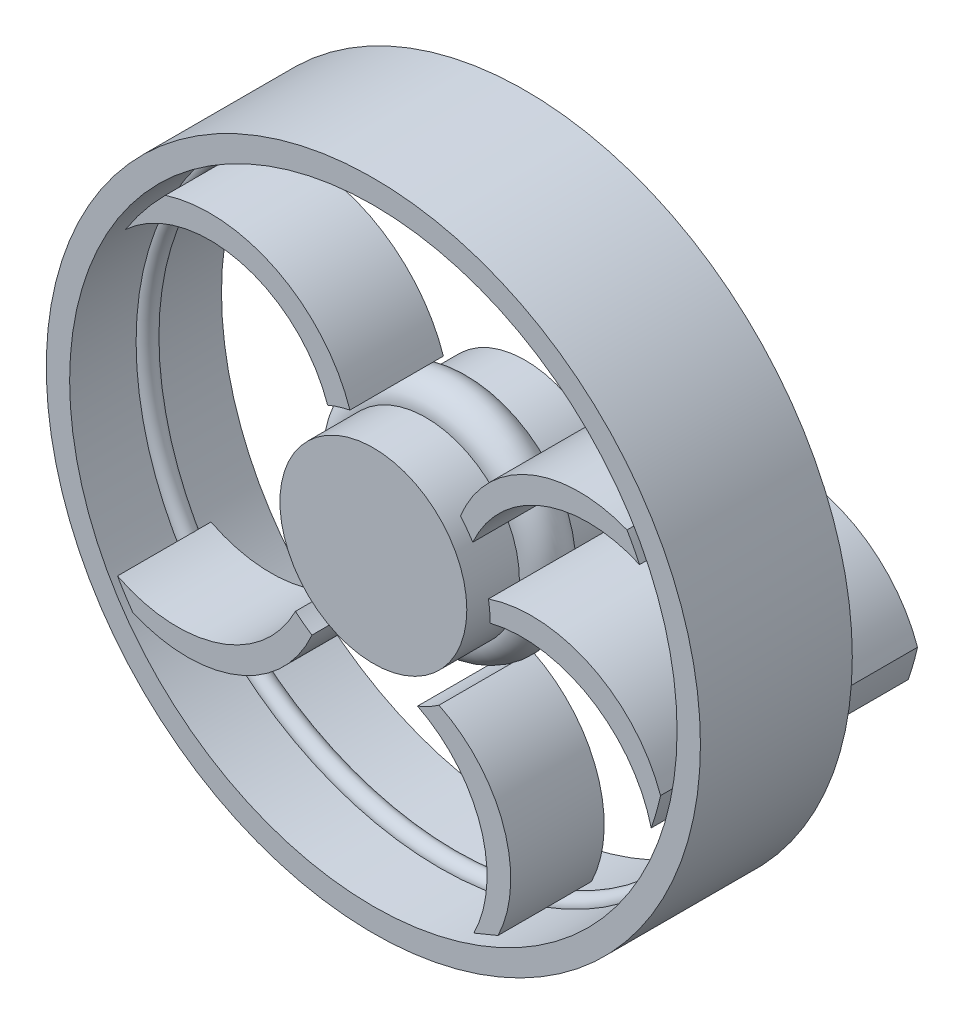
ISO-10303-21;
HEADER;
FILE_DESCRIPTION(('STEP AP214'),'2;1');
FILE_NAME('part.step','',(''),(''),'','','');
FILE_SCHEMA(('AUTOMOTIVE_DESIGN { 1 0 10303 214 1 1 1 1 }'));
ENDSEC;
DATA;
#1=APPLICATION_CONTEXT('core data for automotive mechanical design processes');
#2=APPLICATION_PROTOCOL_DEFINITION('international standard','automotive_design',2000,#1);
#3=PRODUCT_CONTEXT('',#1,'mechanical');
#4=PRODUCT('Part','Part','',(#3));
#5=PRODUCT_RELATED_PRODUCT_CATEGORY('part','',(#4));
#6=PRODUCT_DEFINITION_FORMATION('','',#4);
#7=PRODUCT_DEFINITION_CONTEXT('part definition',#1,'design');
#8=PRODUCT_DEFINITION('design','',#6,#7);
#9=PRODUCT_DEFINITION_SHAPE('','',#8);
#10=(LENGTH_UNIT() NAMED_UNIT(*) SI_UNIT(.MILLI.,.METRE.));
#11=(NAMED_UNIT(*) PLANE_ANGLE_UNIT() SI_UNIT($,.RADIAN.));
#12=(NAMED_UNIT(*) SI_UNIT($,.STERADIAN.) SOLID_ANGLE_UNIT());
#13=UNCERTAINTY_MEASURE_WITH_UNIT(LENGTH_MEASURE(1.E-05),#10,'distance_accuracy_value','');
#14=(GEOMETRIC_REPRESENTATION_CONTEXT(3) GLOBAL_UNCERTAINTY_ASSIGNED_CONTEXT((#13)) GLOBAL_UNIT_ASSIGNED_CONTEXT((#10,
#11,#12)) REPRESENTATION_CONTEXT('',''));
#15=CARTESIAN_POINT('',(0.,0.,0.));
#16=DIRECTION('',(0.,0.,1.));
#17=DIRECTION('',(1.,0.,0.));
#18=AXIS2_PLACEMENT_3D('',#15,#16,#17);
#19=CARTESIAN_POINT('',(0.,0.,-40.));
#20=DIRECTION('',(0.,0.,1.));
#21=DIRECTION('',(1.,0.,0.));
#22=AXIS2_PLACEMENT_3D('',#19,#20,#21);
#23=CYLINDRICAL_SURFACE('',#22,50.);
#24=CARTESIAN_POINT('',(0.,0.,0.));
#25=DIRECTION('',(0.,0.,1.));
#26=DIRECTION('',(1.,0.,0.));
#27=AXIS2_PLACEMENT_3D('',#24,#25,#26);
#28=CIRCLE('',#27,50.);
#29=CARTESIAN_POINT('',(18.9062541712212,-46.2877257295407,0.));
#30=VERTEX_POINT('',#29);
#31=CARTESIAN_POINT('',(28.0803125246057,-41.3702314293801,0.));
#32=VERTEX_POINT('',#31);
#33=EDGE_CURVE('E115',#30,#32,#28,.T.);
#34=ORIENTED_EDGE('',*,*,#33,.T.);
#35=DIRECTION('',(0.,0.,1.));
#36=VECTOR('',#35,1.);
#37=CARTESIAN_POINT('',(28.0803125246057,-41.3702314293801,-40.));
#38=LINE('',#37,#36);
#39=CARTESIAN_POINT('',(28.0803125246057,-41.3702314293801,-40.));
#40=VERTEX_POINT('',#39);
#41=EDGE_CURVE('E12',#40,#32,#38,.T.);
#42=ORIENTED_EDGE('',*,*,#41,.F.);
#43=CARTESIAN_POINT('',(0.,0.,-40.));
#44=DIRECTION('',(0.,0.,1.));
#45=DIRECTION('',(1.,0.,0.));
#46=AXIS2_PLACEMENT_3D('',#43,#44,#45);
#47=CIRCLE('',#46,50.);
#48=CARTESIAN_POINT('',(18.9062541712212,-46.2877257295407,-40.));
#49=VERTEX_POINT('',#48);
#50=EDGE_CURVE('E101',#49,#40,#47,.T.);
#51=ORIENTED_EDGE('',*,*,#50,.F.);
#52=DIRECTION('',(0.,0.,1.));
#53=VECTOR('',#52,1.);
#54=CARTESIAN_POINT('',(18.9062541712212,-46.2877257295407,-40.));
#55=LINE('',#54,#53);
#56=EDGE_CURVE('E68',#49,#30,#55,.T.);
#57=ORIENTED_EDGE('',*,*,#56,.T.);
#58=EDGE_LOOP('',(#34,#42,#51,#57));
#59=FACE_BOUND('',#58,.T.);
#60=ADVANCED_FACE('F52',(#59),#23,.F.);
#61=CARTESIAN_POINT('',(4.37211220984499,-90.369440988968,-40.));
#62=DIRECTION('',(0.,0.,1.));
#63=DIRECTION('',(1.,0.,0.));
#64=AXIS2_PLACEMENT_3D('',#61,#62,#63);
#65=CYLINDRICAL_SURFACE('',#64,54.4334575388081);
#66=CARTESIAN_POINT('',(4.37211220984499,-90.369440988968,0.));
#67=DIRECTION('',(0.,0.,-1.));
#68=DIRECTION('',(-1.,0.,0.));
#69=AXIS2_PLACEMENT_3D('',#66,#67,#68);
#70=CIRCLE('',#69,54.4334575388081);
#71=CARTESIAN_POINT('',(53.3713217694419,-114.07764130371,0.));
#72=VERTEX_POINT('',#71);
#73=EDGE_CURVE('E106',#32,#72,#70,.T.);
#74=ORIENTED_EDGE('',*,*,#73,.T.);
#75=DIRECTION('',(0.,0.,1.));
#76=VECTOR('',#75,1.);
#77=CARTESIAN_POINT('',(53.3713217694419,-114.07764130371,-40.));
#78=LINE('',#77,#76);
#79=CARTESIAN_POINT('',(53.3713217694419,-114.07764130371,-40.));
#80=VERTEX_POINT('',#79);
#81=EDGE_CURVE('E60',#80,#72,#78,.T.);
#82=ORIENTED_EDGE('',*,*,#81,.F.);
#83=CARTESIAN_POINT('',(4.37211220984499,-90.369440988968,-40.));
#84=DIRECTION('',(0.,0.,-1.));
#85=DIRECTION('',(-1.,0.,0.));
#86=AXIS2_PLACEMENT_3D('',#83,#84,#85);
#87=CIRCLE('',#86,54.4334575388081);
#88=EDGE_CURVE('E93',#40,#80,#87,.T.);
#89=ORIENTED_EDGE('',*,*,#88,.F.);
#90=ORIENTED_EDGE('',*,*,#41,.T.);
#91=EDGE_LOOP('',(#74,#82,#89,#90));
#92=FACE_BOUND('',#91,.T.);
#93=ADVANCED_FACE('F105',(#92),#65,.T.);
#94=CARTESIAN_POINT('',(43.0125590708784,-118.376021791655,-40.));
#95=DIRECTION('',(0.383264851547252,-0.923638486404969,0.));
#96=DIRECTION('',(0.923638486404969,0.383264851547252,0.));
#97=AXIS2_PLACEMENT_3D('',#94,#95,#96);
#98=PLANE('',#97);
#99=DIRECTION('',(0.923638486404969,0.383264851547252,0.));
#100=VECTOR('',#99,1.);
#101=CARTESIAN_POINT('',(43.0125590708784,-118.376021791655,0.));
#102=LINE('',#101,#100);
#103=CARTESIAN_POINT('',(43.0125590708784,-118.376021791655,0.));
#104=VERTEX_POINT('',#103);
#105=EDGE_CURVE('E118',#104,#72,#102,.T.);
#106=ORIENTED_EDGE('',*,*,#105,.F.);
#107=DIRECTION('',(0.,0.,1.));
#108=VECTOR('',#107,1.);
#109=CARTESIAN_POINT('',(43.0125590708784,-118.376021791655,-40.));
#110=LINE('',#109,#108);
#111=CARTESIAN_POINT('',(43.0125590708784,-118.376021791655,-40.));
#112=VERTEX_POINT('',#111);
#113=EDGE_CURVE('E82',#112,#104,#110,.T.);
#114=ORIENTED_EDGE('',*,*,#113,.F.);
#115=DIRECTION('',(0.923638486404969,0.383264851547252,0.));
#116=VECTOR('',#115,1.);
#117=CARTESIAN_POINT('',(43.0125590708784,-118.376021791655,-40.));
#118=LINE('',#117,#116);
#119=EDGE_CURVE('E100',#112,#80,#118,.T.);
#120=ORIENTED_EDGE('',*,*,#119,.T.);
#121=ORIENTED_EDGE('',*,*,#81,.T.);
#122=EDGE_LOOP('',(#106,#114,#120,#121));
#123=FACE_BOUND('',#122,.T.);
#124=ADVANCED_FACE('F109',(#123),#98,.T.);
#125=CARTESIAN_POINT('',(-5.11105888695548,-94.3938267669405,-40.));
#126=DIRECTION('',(0.,0.,1.));
#127=DIRECTION('',(1.,0.,0.));
#128=AXIS2_PLACEMENT_3D('',#125,#126,#127);
#129=CYLINDRICAL_SURFACE('',#128,53.7682832490957);
#130=CARTESIAN_POINT('',(-5.11105888695548,-94.3938267669405,0.));
#131=DIRECTION('',(0.,0.,-1.));
#132=DIRECTION('',(-1.,0.,0.));
#133=AXIS2_PLACEMENT_3D('',#130,#131,#132);
#134=CIRCLE('',#133,53.7682832490957);
#135=EDGE_CURVE('E120',#30,#104,#134,.T.);
#136=ORIENTED_EDGE('',*,*,#135,.F.);
#137=ORIENTED_EDGE('',*,*,#56,.F.);
#138=CARTESIAN_POINT('',(-5.11105888695548,-94.3938267669405,-40.));
#139=DIRECTION('',(0.,0.,-1.));
#140=DIRECTION('',(-1.,0.,0.));
#141=AXIS2_PLACEMENT_3D('',#138,#139,#140);
#142=CIRCLE('',#141,53.7682832490957);
#143=EDGE_CURVE('E110',#49,#112,#142,.T.);
#144=ORIENTED_EDGE('',*,*,#143,.T.);
#145=ORIENTED_EDGE('',*,*,#113,.T.);
#146=EDGE_LOOP('',(#136,#137,#144,#145));
#147=FACE_BOUND('',#146,.T.);
#148=ADVANCED_FACE('F126',(#147),#129,.F.);
#149=CARTESIAN_POINT('',(0.,0.,-40.));
#150=DIRECTION('',(0.,0.,1.));
#151=DIRECTION('',(1.,0.,0.));
#152=AXIS2_PLACEMENT_3D('',#149,#150,#151);
#153=PLANE('',#152);
#154=ORIENTED_EDGE('',*,*,#50,.T.);
#155=ORIENTED_EDGE('',*,*,#88,.T.);
#156=ORIENTED_EDGE('',*,*,#119,.F.);
#157=ORIENTED_EDGE('',*,*,#143,.F.);
#158=EDGE_LOOP('',(#154,#155,#156,#157));
#159=FACE_BOUND('',#158,.T.);
#160=ADVANCED_FACE('F97',(#159),#153,.F.);
#161=CARTESIAN_POINT('',(0.,0.,0.));
#162=DIRECTION('',(0.,0.,1.));
#163=DIRECTION('',(1.,0.,0.));
#164=AXIS2_PLACEMENT_3D('',#161,#162,#163);
#165=PLANE('',#164);
#166=ORIENTED_EDGE('',*,*,#33,.F.);
#167=ORIENTED_EDGE('',*,*,#135,.T.);
#168=ORIENTED_EDGE('',*,*,#105,.T.);
#169=ORIENTED_EDGE('',*,*,#73,.F.);
#170=EDGE_LOOP('',(#166,#167,#168,#169));
#171=FACE_BOUND('',#170,.T.);
#172=ADVANCED_FACE('F125',(#171),#165,.T.);
#173=CLOSED_SHELL('',(#60,#93,#124,#148,#160,#172));
#174=MANIFOLD_SOLID_BREP('B2',#173);
#175=CARTESIAN_POINT('',(0.,0.,-40.));
#176=DIRECTION('',(0.,0.,1.));
#177=DIRECTION('',(1.,0.,0.));
#178=AXIS2_PLACEMENT_3D('',#175,#176,#177);
#179=CYLINDRICAL_SURFACE('',#178,50.);
#180=CARTESIAN_POINT('',(0.,0.,0.));
#181=DIRECTION('',(0.,0.,1.));
#182=DIRECTION('',(1.,0.,0.));
#183=AXIS2_PLACEMENT_3D('',#180,#181,#182);
#184=CIRCLE('',#183,50.);
#185=CARTESIAN_POINT('',(42.5423741580309,26.2706376206993,0.));
#186=VERTEX_POINT('',#185);
#187=CARTESIAN_POINT('',(37.2664270143776,33.3348678950745,0.));
#188=VERTEX_POINT('',#187);
#189=EDGE_CURVE('E249',#186,#188,#184,.T.);
#190=ORIENTED_EDGE('',*,*,#189,.T.);
#191=DIRECTION('',(0.,0.,1.));
#192=VECTOR('',#191,1.);
#193=CARTESIAN_POINT('',(37.2664270143776,33.3348678950745,-40.));
#194=LINE('',#193,#192);
#195=CARTESIAN_POINT('',(37.2664270143776,33.3348678950745,-40.));
#196=VERTEX_POINT('',#195);
#197=EDGE_CURVE('E50',#196,#188,#194,.T.);
#198=ORIENTED_EDGE('',*,*,#197,.F.);
#199=CARTESIAN_POINT('',(0.,0.,-40.));
#200=DIRECTION('',(0.,0.,1.));
#201=DIRECTION('',(1.,0.,0.));
#202=AXIS2_PLACEMENT_3D('',#199,#200,#201);
#203=CIRCLE('',#202,50.);
#204=CARTESIAN_POINT('',(42.5423741580309,26.2706376206993,-40.));
#205=VERTEX_POINT('',#204);
#206=EDGE_CURVE('E235',#205,#196,#203,.T.);
#207=ORIENTED_EDGE('',*,*,#206,.F.);
#208=DIRECTION('',(0.,0.,1.));
#209=VECTOR('',#208,1.);
#210=CARTESIAN_POINT('',(42.5423741580309,26.2706376206993,-40.));
#211=LINE('',#210,#209);
#212=EDGE_CURVE('E202',#205,#186,#211,.T.);
#213=ORIENTED_EDGE('',*,*,#212,.T.);
#214=EDGE_LOOP('',(#190,#198,#207,#213));
#215=FACE_BOUND('',#214,.T.);
#216=ADVANCED_FACE('F186',(#215),#179,.F.);
#217=CARTESIAN_POINT('',(88.1709478208434,12.9366059497339,-40.));
#218=DIRECTION('',(0.,0.,1.));
#219=DIRECTION('',(1.,0.,0.));
#220=AXIS2_PLACEMENT_3D('',#217,#218,#219);
#221=CYLINDRICAL_SURFACE('',#220,54.8393957746312);
#222=CARTESIAN_POINT('',(88.1709478208434,12.9366059497339,0.));
#223=DIRECTION('',(0.,0.,-1.));
#224=DIRECTION('',(-1.,0.,0.));
#225=AXIS2_PLACEMENT_3D('',#222,#223,#224);
#226=CIRCLE('',#225,54.8393957746312);
#227=CARTESIAN_POINT('',(108.569209755877,63.8411267603298,0.));
#228=VERTEX_POINT('',#227);
#229=EDGE_CURVE('E240',#188,#228,#226,.T.);
#230=ORIENTED_EDGE('',*,*,#229,.T.);
#231=DIRECTION('',(0.,0.,1.));
#232=VECTOR('',#231,1.);
#233=CARTESIAN_POINT('',(108.569209755877,63.8411267603298,-40.));
#234=LINE('',#233,#232);
#235=CARTESIAN_POINT('',(108.569209755877,63.8411267603298,-40.));
#236=VERTEX_POINT('',#235);
#237=EDGE_CURVE('E194',#236,#228,#234,.T.);
#238=ORIENTED_EDGE('',*,*,#237,.F.);
#239=CARTESIAN_POINT('',(88.1709478208434,12.9366059497339,-40.));
#240=DIRECTION('',(0.,0.,-1.));
#241=DIRECTION('',(-1.,0.,0.));
#242=AXIS2_PLACEMENT_3D('',#239,#240,#241);
#243=CIRCLE('',#242,54.8393957746312);
#244=EDGE_CURVE('E227',#196,#236,#243,.T.);
#245=ORIENTED_EDGE('',*,*,#244,.F.);
#246=ORIENTED_EDGE('',*,*,#197,.T.);
#247=EDGE_LOOP('',(#230,#238,#245,#246));
#248=FACE_BOUND('',#247,.T.);
#249=ADVANCED_FACE('F239',(#248),#221,.T.);
#250=CARTESIAN_POINT('',(0.,0.,-40.));
#251=DIRECTION('',(0.,0.,1.));
#252=DIRECTION('',(1.,0.,0.));
#253=AXIS2_PLACEMENT_3D('',#250,#251,#252);
#254=CYLINDRICAL_SURFACE('',#253,125.948254346951);
#255=CARTESIAN_POINT('',(0.,0.,0.));
#256=DIRECTION('',(0.,0.,1.));
#257=DIRECTION('',(1.,0.,0.));
#258=AXIS2_PLACEMENT_3D('',#255,#256,#257);
#259=CIRCLE('',#258,125.948254346951);
#260=CARTESIAN_POINT('',(113.940281581626,53.6709884960567,0.));
#261=VERTEX_POINT('',#260);
#262=EDGE_CURVE('E252',#261,#228,#259,.T.);
#263=ORIENTED_EDGE('',*,*,#262,.F.);
#264=DIRECTION('',(0.,0.,1.));
#265=VECTOR('',#264,1.);
#266=CARTESIAN_POINT('',(113.940281581626,53.6709884960567,-40.));
#267=LINE('',#266,#265);
#268=CARTESIAN_POINT('',(113.940281581626,53.6709884960567,-40.));
#269=VERTEX_POINT('',#268);
#270=EDGE_CURVE('E216',#269,#261,#267,.T.);
#271=ORIENTED_EDGE('',*,*,#270,.F.);
#272=CARTESIAN_POINT('',(0.,0.,-40.));
#273=DIRECTION('',(0.,0.,1.));
#274=DIRECTION('',(1.,0.,0.));
#275=AXIS2_PLACEMENT_3D('',#272,#273,#274);
#276=CIRCLE('',#275,125.948254346951);
#277=EDGE_CURVE('E234',#269,#236,#276,.T.);
#278=ORIENTED_EDGE('',*,*,#277,.T.);
#279=ORIENTED_EDGE('',*,*,#237,.T.);
#280=EDGE_LOOP('',(#263,#271,#278,#279));
#281=FACE_BOUND('',#280,.T.);
#282=ADVANCED_FACE('F243',(#281),#254,.T.);
#283=CARTESIAN_POINT('',(91.9415033078629,4.27185934565388,-40.));
#284=DIRECTION('',(0.,0.,1.));
#285=DIRECTION('',(1.,0.,0.));
#286=AXIS2_PLACEMENT_3D('',#283,#284,#285);
#287=CYLINDRICAL_SURFACE('',#286,54.0760594566245);
#288=CARTESIAN_POINT('',(91.9415033078629,4.27185934565388,0.));
#289=DIRECTION('',(0.,0.,-1.));
#290=DIRECTION('',(-1.,0.,0.));
#291=AXIS2_PLACEMENT_3D('',#288,#289,#290);
#292=CIRCLE('',#291,54.0760594566245);
#293=EDGE_CURVE('E254',#186,#261,#292,.T.);
#294=ORIENTED_EDGE('',*,*,#293,.F.);
#295=ORIENTED_EDGE('',*,*,#212,.F.);
#296=CARTESIAN_POINT('',(91.9415033078629,4.27185934565388,-40.));
#297=DIRECTION('',(0.,0.,-1.));
#298=DIRECTION('',(-1.,0.,0.));
#299=AXIS2_PLACEMENT_3D('',#296,#297,#298);
#300=CIRCLE('',#299,54.0760594566245);
#301=EDGE_CURVE('E244',#205,#269,#300,.T.);
#302=ORIENTED_EDGE('',*,*,#301,.T.);
#303=ORIENTED_EDGE('',*,*,#270,.T.);
#304=EDGE_LOOP('',(#294,#295,#302,#303));
#305=FACE_BOUND('',#304,.T.);
#306=ADVANCED_FACE('F260',(#305),#287,.F.);
#307=CARTESIAN_POINT('',(44.0854739104217,6.46830297486697,-40.));
#308=DIRECTION('',(0.,0.,1.));
#309=DIRECTION('',(1.,0.,0.));
#310=AXIS2_PLACEMENT_3D('',#307,#308,#309);
#311=PLANE('',#310);
#312=ORIENTED_EDGE('',*,*,#206,.T.);
#313=ORIENTED_EDGE('',*,*,#244,.T.);
#314=ORIENTED_EDGE('',*,*,#277,.F.);
#315=ORIENTED_EDGE('',*,*,#301,.F.);
#316=EDGE_LOOP('',(#312,#313,#314,#315));
#317=FACE_BOUND('',#316,.T.);
#318=ADVANCED_FACE('F231',(#317),#311,.F.);
#319=CARTESIAN_POINT('',(44.0854739104217,6.46830297486697,0.));
#320=DIRECTION('',(0.,0.,1.));
#321=DIRECTION('',(1.,0.,0.));
#322=AXIS2_PLACEMENT_3D('',#319,#320,#321);
#323=PLANE('',#322);
#324=ORIENTED_EDGE('',*,*,#189,.F.);
#325=ORIENTED_EDGE('',*,*,#293,.T.);
#326=ORIENTED_EDGE('',*,*,#262,.T.);
#327=ORIENTED_EDGE('',*,*,#229,.F.);
#328=EDGE_LOOP('',(#324,#325,#326,#327));
#329=FACE_BOUND('',#328,.T.);
#330=ADVANCED_FACE('F259',(#329),#323,.T.);
#331=CLOSED_SHELL('',(#216,#249,#282,#306,#318,#330));
#332=MANIFOLD_SOLID_BREP('B6',#331);
#333=CARTESIAN_POINT('',(0.,0.,-40.));
#334=DIRECTION('',(0.,0.,1.));
#335=DIRECTION('',(1.,0.,0.));
#336=AXIS2_PLACEMENT_3D('',#333,#334,#335);
#337=CYLINDRICAL_SURFACE('',#336,50.);
#338=CARTESIAN_POINT('',(0.,0.,0.));
#339=DIRECTION('',(0.,0.,1.));
#340=DIRECTION('',(1.,0.,0.));
#341=AXIS2_PLACEMENT_3D('',#338,#339,#340);
#342=CIRCLE('',#341,50.);
#343=CARTESIAN_POINT('',(-33.3348678950743,-37.2664270143777,0.));
#344=VERTEX_POINT('',#343);
#345=CARTESIAN_POINT('',(-26.2706376206991,-42.542374158031,0.));
#346=VERTEX_POINT('',#345);
#347=EDGE_CURVE('E383',#344,#346,#342,.T.);
#348=ORIENTED_EDGE('',*,*,#347,.T.);
#349=DIRECTION('',(0.,0.,1.));
#350=VECTOR('',#349,1.);
#351=CARTESIAN_POINT('',(-26.2706376206991,-42.542374158031,-40.));
#352=LINE('',#351,#350);
#353=CARTESIAN_POINT('',(-26.2706376206991,-42.542374158031,-40.));
#354=VERTEX_POINT('',#353);
#355=EDGE_CURVE('E184',#354,#346,#352,.T.);
#356=ORIENTED_EDGE('',*,*,#355,.F.);
#357=CARTESIAN_POINT('',(0.,0.,-40.));
#358=DIRECTION('',(0.,0.,1.));
#359=DIRECTION('',(1.,0.,0.));
#360=AXIS2_PLACEMENT_3D('',#357,#358,#359);
#361=CIRCLE('',#360,50.);
#362=CARTESIAN_POINT('',(-33.3348678950743,-37.2664270143777,-40.));
#363=VERTEX_POINT('',#362);
#364=EDGE_CURVE('E369',#363,#354,#361,.T.);
#365=ORIENTED_EDGE('',*,*,#364,.F.);
#366=DIRECTION('',(0.,0.,1.));
#367=VECTOR('',#366,1.);
#368=CARTESIAN_POINT('',(-33.3348678950743,-37.2664270143777,-40.));
#369=LINE('',#368,#367);
#370=EDGE_CURVE('E336',#363,#344,#369,.T.);
#371=ORIENTED_EDGE('',*,*,#370,.T.);
#372=EDGE_LOOP('',(#348,#356,#365,#371));
#373=FACE_BOUND('',#372,.T.);
#374=ADVANCED_FACE('F320',(#373),#337,.F.);
#375=CARTESIAN_POINT('',(-79.6015695015972,-19.1217618605313,-40.));
#376=DIRECTION('',(0.,0.,1.));
#377=DIRECTION('',(1.,0.,0.));
#378=AXIS2_PLACEMENT_3D('',#375,#376,#377);
#379=CYLINDRICAL_SURFACE('',#378,58.247003147585);
#380=CARTESIAN_POINT('',(-79.6015695015972,-19.1217618605313,0.));
#381=DIRECTION('',(0.,0.,-1.));
#382=DIRECTION('',(-1.,0.,0.));
#383=AXIS2_PLACEMENT_3D('',#380,#381,#382);
#384=CIRCLE('',#383,58.247003147585);
#385=CARTESIAN_POINT('',(-103.022181799158,-72.4526937414027,0.));
#386=VERTEX_POINT('',#385);
#387=EDGE_CURVE('E374',#346,#386,#384,.T.);
#388=ORIENTED_EDGE('',*,*,#387,.T.);
#389=DIRECTION('',(0.,0.,1.));
#390=VECTOR('',#389,1.);
#391=CARTESIAN_POINT('',(-103.022181799158,-72.4526937414027,-40.));
#392=LINE('',#391,#390);
#393=CARTESIAN_POINT('',(-103.022181799158,-72.4526937414027,-40.));
#394=VERTEX_POINT('',#393);
#395=EDGE_CURVE('E328',#394,#386,#392,.T.);
#396=ORIENTED_EDGE('',*,*,#395,.F.);
#397=CARTESIAN_POINT('',(-79.6015695015972,-19.1217618605313,-40.));
#398=DIRECTION('',(0.,0.,-1.));
#399=DIRECTION('',(-1.,0.,0.));
#400=AXIS2_PLACEMENT_3D('',#397,#398,#399);
#401=CIRCLE('',#400,58.247003147585);
#402=EDGE_CURVE('E361',#354,#394,#401,.T.);
#403=ORIENTED_EDGE('',*,*,#402,.F.);
#404=ORIENTED_EDGE('',*,*,#355,.T.);
#405=EDGE_LOOP('',(#388,#396,#403,#404));
#406=FACE_BOUND('',#405,.T.);
#407=ADVANCED_FACE('F373',(#406),#379,.T.);
#408=CARTESIAN_POINT('',(0.,0.,-40.));
#409=DIRECTION('',(0.,0.,1.));
#410=DIRECTION('',(1.,0.,0.));
#411=AXIS2_PLACEMENT_3D('',#408,#409,#410);
#412=CYLINDRICAL_SURFACE('',#411,125.948254346951);
#413=CARTESIAN_POINT('',(0.,0.,0.));
#414=DIRECTION('',(0.,0.,1.));
#415=DIRECTION('',(1.,0.,0.));
#416=AXIS2_PLACEMENT_3D('',#413,#414,#415);
#417=CIRCLE('',#416,125.948254346951);
#418=CARTESIAN_POINT('',(-109.497512233642,-62.2355010238338,0.));
#419=VERTEX_POINT('',#418);
#420=EDGE_CURVE('E386',#419,#386,#417,.T.);
#421=ORIENTED_EDGE('',*,*,#420,.F.);
#422=DIRECTION('',(0.,0.,1.));
#423=VECTOR('',#422,1.);
#424=CARTESIAN_POINT('',(-109.497512233642,-62.2355010238338,-40.));
#425=LINE('',#424,#423);
#426=CARTESIAN_POINT('',(-109.497512233642,-62.2355010238338,-40.));
#427=VERTEX_POINT('',#426);
#428=EDGE_CURVE('E350',#427,#419,#425,.T.);
#429=ORIENTED_EDGE('',*,*,#428,.F.);
#430=CARTESIAN_POINT('',(0.,0.,-40.));
#431=DIRECTION('',(0.,0.,1.));
#432=DIRECTION('',(1.,0.,0.));
#433=AXIS2_PLACEMENT_3D('',#430,#431,#432);
#434=CIRCLE('',#433,125.948254346951);
#435=EDGE_CURVE('E368',#427,#394,#434,.T.);
#436=ORIENTED_EDGE('',*,*,#435,.T.);
#437=ORIENTED_EDGE('',*,*,#395,.T.);
#438=EDGE_LOOP('',(#421,#429,#436,#437));
#439=FACE_BOUND('',#438,.T.);
#440=ADVANCED_FACE('F377',(#439),#412,.T.);
#441=CARTESIAN_POINT('',(-83.900727091019,-11.6696417829208,-40.));
#442=DIRECTION('',(0.,0.,1.));
#443=DIRECTION('',(1.,0.,0.));
#444=AXIS2_PLACEMENT_3D('',#441,#442,#443);
#445=CYLINDRICAL_SURFACE('',#444,56.6754049867262);
#446=CARTESIAN_POINT('',(-83.900727091019,-11.6696417829208,0.));
#447=DIRECTION('',(0.,0.,-1.));
#448=DIRECTION('',(-1.,0.,0.));
#449=AXIS2_PLACEMENT_3D('',#446,#447,#448);
#450=CIRCLE('',#449,56.6754049867262);
#451=EDGE_CURVE('E388',#344,#419,#450,.T.);
#452=ORIENTED_EDGE('',*,*,#451,.F.);
#453=ORIENTED_EDGE('',*,*,#370,.F.);
#454=CARTESIAN_POINT('',(-83.900727091019,-11.6696417829208,-40.));
#455=DIRECTION('',(0.,0.,-1.));
#456=DIRECTION('',(-1.,0.,0.));
#457=AXIS2_PLACEMENT_3D('',#454,#455,#456);
#458=CIRCLE('',#457,56.6754049867262);
#459=EDGE_CURVE('E378',#363,#427,#458,.T.);
#460=ORIENTED_EDGE('',*,*,#459,.T.);
#461=ORIENTED_EDGE('',*,*,#428,.T.);
#462=EDGE_LOOP('',(#452,#453,#460,#461));
#463=FACE_BOUND('',#462,.T.);
#464=ADVANCED_FACE('F394',(#463),#445,.F.);
#465=CARTESIAN_POINT('',(-39.8007847507986,-9.56088093026566,-40.));
#466=DIRECTION('',(0.,0.,1.));
#467=DIRECTION('',(1.,0.,0.));
#468=AXIS2_PLACEMENT_3D('',#465,#466,#467);
#469=PLANE('',#468);
#470=ORIENTED_EDGE('',*,*,#364,.T.);
#471=ORIENTED_EDGE('',*,*,#402,.T.);
#472=ORIENTED_EDGE('',*,*,#435,.F.);
#473=ORIENTED_EDGE('',*,*,#459,.F.);
#474=EDGE_LOOP('',(#470,#471,#472,#473));
#475=FACE_BOUND('',#474,.T.);
#476=ADVANCED_FACE('F365',(#475),#469,.F.);
#477=CARTESIAN_POINT('',(-39.8007847507986,-9.56088093026566,0.));
#478=DIRECTION('',(0.,0.,1.));
#479=DIRECTION('',(1.,0.,0.));
#480=AXIS2_PLACEMENT_3D('',#477,#478,#479);
#481=PLANE('',#480);
#482=ORIENTED_EDGE('',*,*,#347,.F.);
#483=ORIENTED_EDGE('',*,*,#451,.T.);
#484=ORIENTED_EDGE('',*,*,#420,.T.);
#485=ORIENTED_EDGE('',*,*,#387,.F.);
#486=EDGE_LOOP('',(#482,#483,#484,#485));
#487=FACE_BOUND('',#486,.T.);
#488=ADVANCED_FACE('F393',(#487),#481,.T.);
#489=CLOSED_SHELL('',(#374,#407,#440,#464,#476,#488));
#490=MANIFOLD_SOLID_BREP('B44',#489);
#491=CARTESIAN_POINT('',(0.,0.,-110.));
#492=DIRECTION('',(0.,0.,1.));
#493=DIRECTION('',(1.,0.,0.));
#494=AXIS2_PLACEMENT_3D('',#491,#492,#493);
#495=CYLINDRICAL_SURFACE('',#494,50.);
#496=CARTESIAN_POINT('',(0.,0.,0.));
#497=DIRECTION('',(0.,0.,1.));
#498=DIRECTION('',(1.,0.,0.));
#499=AXIS2_PLACEMENT_3D('',#496,#497,#498);
#500=CIRCLE('',#499,50.);
#501=CARTESIAN_POINT('',(50.,0.,0.));
#502=VERTEX_POINT('',#501);
#503=CARTESIAN_POINT('',(49.2508966727688,8.62259687844962,0.));
#504=VERTEX_POINT('',#503);
#505=EDGE_CURVE('E517',#502,#504,#500,.T.);
#506=ORIENTED_EDGE('',*,*,#505,.T.);
#507=DIRECTION('',(0.,0.,1.));
#508=VECTOR('',#507,1.);
#509=CARTESIAN_POINT('',(49.2508966727688,8.62259687844962,-110.));
#510=LINE('',#509,#508);
#511=CARTESIAN_POINT('',(49.2508966727688,8.62259687844962,-110.));
#512=VERTEX_POINT('',#511);
#513=EDGE_CURVE('E318',#512,#504,#510,.T.);
#514=ORIENTED_EDGE('',*,*,#513,.F.);
#515=CARTESIAN_POINT('',(0.,0.,-110.));
#516=DIRECTION('',(0.,0.,1.));
#517=DIRECTION('',(1.,0.,0.));
#518=AXIS2_PLACEMENT_3D('',#515,#516,#517);
#519=CIRCLE('',#518,50.);
#520=CARTESIAN_POINT('',(50.,0.,-110.));
#521=VERTEX_POINT('',#520);
#522=EDGE_CURVE('E503',#521,#512,#519,.T.);
#523=ORIENTED_EDGE('',*,*,#522,.F.);
#524=DIRECTION('',(0.,0.,1.));
#525=VECTOR('',#524,1.);
#526=CARTESIAN_POINT('',(50.,0.,-110.));
#527=LINE('',#526,#525);
#528=EDGE_CURVE('E470',#521,#502,#527,.T.);
#529=ORIENTED_EDGE('',*,*,#528,.T.);
#530=EDGE_LOOP('',(#506,#514,#523,#529));
#531=FACE_BOUND('',#530,.T.);
#532=ADVANCED_FACE('F454',(#531),#495,.F.);
#533=CARTESIAN_POINT('',(67.7414531391762,-46.8732065504468,-110.));
#534=DIRECTION('',(0.,0.,1.));
#535=DIRECTION('',(1.,0.,0.));
#536=AXIS2_PLACEMENT_3D('',#533,#534,#535);
#537=CYLINDRICAL_SURFACE('',#536,58.4951696865315);
#538=CARTESIAN_POINT('',(67.7414531391762,-46.8732065504468,0.));
#539=DIRECTION('',(0.,0.,-1.));
#540=DIRECTION('',(-1.,0.,0.));
#541=AXIS2_PLACEMENT_3D('',#538,#539,#540);
#542=CIRCLE('',#541,58.4951696865315);
#543=CARTESIAN_POINT('',(122.919460363589,-27.4548545246241,0.));
#544=VERTEX_POINT('',#543);
#545=EDGE_CURVE('E508',#504,#544,#542,.T.);
#546=ORIENTED_EDGE('',*,*,#545,.T.);
#547=DIRECTION('',(0.,0.,1.));
#548=VECTOR('',#547,1.);
#549=CARTESIAN_POINT('',(122.919460363589,-27.4548545246241,-110.));
#550=LINE('',#549,#548);
#551=CARTESIAN_POINT('',(122.919460363589,-27.4548545246241,-110.));
#552=VERTEX_POINT('',#551);
#553=EDGE_CURVE('E462',#552,#544,#550,.T.);
#554=ORIENTED_EDGE('',*,*,#553,.F.);
#555=CARTESIAN_POINT('',(67.7414531391762,-46.8732065504468,-110.));
#556=DIRECTION('',(0.,0.,-1.));
#557=DIRECTION('',(-1.,0.,0.));
#558=AXIS2_PLACEMENT_3D('',#555,#556,#557);
#559=CIRCLE('',#558,58.4951696865315);
#560=EDGE_CURVE('E495',#512,#552,#559,.T.);
#561=ORIENTED_EDGE('',*,*,#560,.F.);
#562=ORIENTED_EDGE('',*,*,#513,.T.);
#563=EDGE_LOOP('',(#546,#554,#561,#562));
#564=FACE_BOUND('',#563,.T.);
#565=ADVANCED_FACE('F507',(#564),#537,.T.);
#566=CARTESIAN_POINT('',(0.,0.,-110.));
#567=DIRECTION('',(0.,0.,1.));
#568=DIRECTION('',(1.,0.,0.));
#569=AXIS2_PLACEMENT_3D('',#566,#567,#568);
#570=CYLINDRICAL_SURFACE('',#569,125.948254346951);
#571=CARTESIAN_POINT('',(0.,0.,0.));
#572=DIRECTION('',(0.,0.,1.));
#573=DIRECTION('',(1.,0.,0.));
#574=AXIS2_PLACEMENT_3D('',#571,#572,#573);
#575=CIRCLE('',#574,125.948254346951);
#576=CARTESIAN_POINT('',(118.931988864751,-41.4505102226601,0.));
#577=VERTEX_POINT('',#576);
#578=EDGE_CURVE('E520',#577,#544,#575,.T.);
#579=ORIENTED_EDGE('',*,*,#578,.F.);
#580=DIRECTION('',(0.,0.,1.));
#581=VECTOR('',#580,1.);
#582=CARTESIAN_POINT('',(118.931988864751,-41.4505102226601,-110.));
#583=LINE('',#582,#581);
#584=CARTESIAN_POINT('',(118.931988864751,-41.4505102226601,-110.));
#585=VERTEX_POINT('',#584);
#586=EDGE_CURVE('E484',#585,#577,#583,.T.);
#587=ORIENTED_EDGE('',*,*,#586,.F.);
#588=CARTESIAN_POINT('',(0.,0.,-110.));
#589=DIRECTION('',(0.,0.,1.));
#590=DIRECTION('',(1.,0.,0.));
#591=AXIS2_PLACEMENT_3D('',#588,#589,#590);
#592=CIRCLE('',#591,125.948254346951);
#593=EDGE_CURVE('E502',#585,#552,#592,.T.);
#594=ORIENTED_EDGE('',*,*,#593,.T.);
#595=ORIENTED_EDGE('',*,*,#553,.T.);
#596=EDGE_LOOP('',(#579,#587,#594,#595));
#597=FACE_BOUND('',#596,.T.);
#598=ADVANCED_FACE('F511',(#597),#570,.T.);
#599=CARTESIAN_POINT('',(63.7407393202208,-55.1912495450773,-110.));
#600=DIRECTION('',(0.,0.,1.));
#601=DIRECTION('',(1.,0.,0.));
#602=AXIS2_PLACEMENT_3D('',#599,#600,#601);
#603=CYLINDRICAL_SURFACE('',#602,56.8760225702647);
#604=CARTESIAN_POINT('',(63.7407393202208,-55.1912495450773,0.));
#605=DIRECTION('',(0.,0.,-1.));
#606=DIRECTION('',(-1.,0.,0.));
#607=AXIS2_PLACEMENT_3D('',#604,#605,#606);
#608=CIRCLE('',#607,56.8760225702647);
#609=EDGE_CURVE('E522',#502,#577,#608,.T.);
#610=ORIENTED_EDGE('',*,*,#609,.F.);
#611=ORIENTED_EDGE('',*,*,#528,.F.);
#612=CARTESIAN_POINT('',(63.7407393202208,-55.1912495450773,-110.));
#613=DIRECTION('',(0.,0.,-1.));
#614=DIRECTION('',(-1.,0.,0.));
#615=AXIS2_PLACEMENT_3D('',#612,#613,#614);
#616=CIRCLE('',#615,56.8760225702647);
#617=EDGE_CURVE('E512',#521,#585,#616,.T.);
#618=ORIENTED_EDGE('',*,*,#617,.T.);
#619=ORIENTED_EDGE('',*,*,#586,.T.);
#620=EDGE_LOOP('',(#610,#611,#618,#619));
#621=FACE_BOUND('',#620,.T.);
#622=ADVANCED_FACE('F528',(#621),#603,.F.);
#623=CARTESIAN_POINT('',(33.8707265695881,-23.4366032752234,-110.));
#624=DIRECTION('',(0.,0.,1.));
#625=DIRECTION('',(1.,0.,0.));
#626=AXIS2_PLACEMENT_3D('',#623,#624,#625);
#627=PLANE('',#626);
#628=ORIENTED_EDGE('',*,*,#522,.T.);
#629=ORIENTED_EDGE('',*,*,#560,.T.);
#630=ORIENTED_EDGE('',*,*,#593,.F.);
#631=ORIENTED_EDGE('',*,*,#617,.F.);
#632=EDGE_LOOP('',(#628,#629,#630,#631));
#633=FACE_BOUND('',#632,.T.);
#634=ADVANCED_FACE('F499',(#633),#627,.F.);
#635=CARTESIAN_POINT('',(33.8707265695881,-23.4366032752234,0.));
#636=DIRECTION('',(0.,0.,1.));
#637=DIRECTION('',(1.,0.,0.));
#638=AXIS2_PLACEMENT_3D('',#635,#636,#637);
#639=PLANE('',#638);
#640=ORIENTED_EDGE('',*,*,#505,.F.);
#641=ORIENTED_EDGE('',*,*,#609,.T.);
#642=ORIENTED_EDGE('',*,*,#578,.T.);
#643=ORIENTED_EDGE('',*,*,#545,.F.);
#644=EDGE_LOOP('',(#640,#641,#642,#643));
#645=FACE_BOUND('',#644,.T.);
#646=ADVANCED_FACE('F527',(#645),#639,.T.);
#647=CLOSED_SHELL('',(#532,#565,#598,#622,#634,#646));
#648=MANIFOLD_SOLID_BREP('B178_NOT_SHOWN',#647);
#649=CARTESIAN_POINT('',(0.,0.,-40.));
#650=DIRECTION('',(0.,0.,1.));
#651=DIRECTION('',(1.,0.,0.));
#652=AXIS2_PLACEMENT_3D('',#649,#650,#651);
#653=CYLINDRICAL_SURFACE('',#652,125.948254346951);
#654=CARTESIAN_POINT('',(0.,0.,0.));
#655=DIRECTION('',(0.,0.,1.));
#656=DIRECTION('',(1.,0.,0.));
#657=AXIS2_PLACEMENT_3D('',#654,#655,#656);
#658=CIRCLE('',#657,125.948254346951);
#659=CARTESIAN_POINT('',(-89.0385278452061,89.0791969665341,0.));
#660=VERTEX_POINT('',#659);
#661=CARTESIAN_POINT('',(-106.069282820074,67.9136953425394,0.));
#662=VERTEX_POINT('',#661);
#663=EDGE_CURVE('E651',#660,#662,#658,.T.);
#664=ORIENTED_EDGE('',*,*,#663,.F.);
#665=DIRECTION('',(0.,0.,1.));
#666=VECTOR('',#665,1.);
#667=CARTESIAN_POINT('',(-89.0385278452061,89.0791969665341,-40.));
#668=LINE('',#667,#666);
#669=CARTESIAN_POINT('',(-89.0385278452061,89.0791969665341,-40.));
#670=VERTEX_POINT('',#669);
#671=EDGE_CURVE('E452',#670,#660,#668,.T.);
#672=ORIENTED_EDGE('',*,*,#671,.F.);
#673=CARTESIAN_POINT('',(0.,0.,-40.));
#674=DIRECTION('',(0.,0.,1.));
#675=DIRECTION('',(1.,0.,0.));
#676=AXIS2_PLACEMENT_3D('',#673,#674,#675);
#677=CIRCLE('',#676,125.948254346951);
#678=CARTESIAN_POINT('',(-106.069282820074,67.9136953425394,-40.));
#679=VERTEX_POINT('',#678);
#680=EDGE_CURVE('E646',#670,#679,#677,.T.);
#681=ORIENTED_EDGE('',*,*,#680,.T.);
#682=DIRECTION('',(0.,0.,1.));
#683=VECTOR('',#682,1.);
#684=CARTESIAN_POINT('',(-106.069282820074,67.9136953425394,-40.));
#685=LINE('',#684,#683);
#686=EDGE_CURVE('E589',#679,#662,#685,.T.);
#687=ORIENTED_EDGE('',*,*,#686,.T.);
#688=EDGE_LOOP('',(#664,#672,#681,#687));
#689=FACE_BOUND('',#688,.T.);
#690=ADVANCED_FACE('F586',(#689),#653,.T.);
#691=CARTESIAN_POINT('',(-69.9576722730367,28.765177814367,-40.));
#692=DIRECTION('',(0.,0.,1.));
#693=DIRECTION('',(1.,0.,0.));
#694=AXIS2_PLACEMENT_3D('',#691,#692,#693);
#695=CYLINDRICAL_SURFACE('',#694,63.2602557349713);
#696=CARTESIAN_POINT('',(-69.9576722730367,28.765177814367,0.));
#697=DIRECTION('',(0.,0.,-1.));
#698=DIRECTION('',(-1.,0.,0.));
#699=AXIS2_PLACEMENT_3D('',#696,#697,#698);
#700=CIRCLE('',#699,63.2602557349713);
#701=CARTESIAN_POINT('',(-10.0163671231561,48.9864510824591,0.));
#702=VERTEX_POINT('',#701);
#703=EDGE_CURVE('E619',#660,#702,#700,.T.);
#704=ORIENTED_EDGE('',*,*,#703,.T.);
#705=DIRECTION('',(0.,0.,1.));
#706=VECTOR('',#705,1.);
#707=CARTESIAN_POINT('',(-10.0163671231561,48.9864510824591,-40.));
#708=LINE('',#707,#706);
#709=CARTESIAN_POINT('',(-10.0163671231561,48.9864510824591,-40.));
#710=VERTEX_POINT('',#709);
#711=EDGE_CURVE('E595',#710,#702,#708,.T.);
#712=ORIENTED_EDGE('',*,*,#711,.F.);
#713=CARTESIAN_POINT('',(-69.9576722730367,28.765177814367,-40.));
#714=DIRECTION('',(0.,0.,-1.));
#715=DIRECTION('',(-1.,0.,0.));
#716=AXIS2_PLACEMENT_3D('',#713,#714,#715);
#717=CIRCLE('',#716,63.2602557349713);
#718=EDGE_CURVE('E636',#670,#710,#717,.T.);
#719=ORIENTED_EDGE('',*,*,#718,.F.);
#720=ORIENTED_EDGE('',*,*,#671,.T.);
#721=EDGE_LOOP('',(#704,#712,#719,#720));
#722=FACE_BOUND('',#721,.T.);
#723=ADVANCED_FACE('F661',(#722),#695,.T.);
#724=CARTESIAN_POINT('',(0.,0.,-40.));
#725=DIRECTION('',(0.,0.,1.));
#726=DIRECTION('',(1.,0.,0.));
#727=AXIS2_PLACEMENT_3D('',#724,#725,#726);
#728=CYLINDRICAL_SURFACE('',#727,50.);
#729=CARTESIAN_POINT('',(0.,0.,0.));
#730=DIRECTION('',(0.,0.,1.));
#731=DIRECTION('',(1.,0.,0.));
#732=AXIS2_PLACEMENT_3D('',#729,#730,#731);
#733=CIRCLE('',#732,50.);
#734=CARTESIAN_POINT('',(-19.5672470300258,46.01220320378,0.));
#735=VERTEX_POINT('',#734);
#736=EDGE_CURVE('E643',#702,#735,#733,.T.);
#737=ORIENTED_EDGE('',*,*,#736,.T.);
#738=DIRECTION('',(0.,0.,1.));
#739=VECTOR('',#738,1.);
#740=CARTESIAN_POINT('',(-19.5672470300258,46.01220320378,-40.));
#741=LINE('',#740,#739);
#742=CARTESIAN_POINT('',(-19.5672470300258,46.01220320378,-40.));
#743=VERTEX_POINT('',#742);
#744=EDGE_CURVE('E640',#743,#735,#741,.T.);
#745=ORIENTED_EDGE('',*,*,#744,.F.);
#746=CARTESIAN_POINT('',(0.,0.,-40.));
#747=DIRECTION('',(0.,0.,1.));
#748=DIRECTION('',(1.,0.,0.));
#749=AXIS2_PLACEMENT_3D('',#746,#747,#748);
#750=CIRCLE('',#749,50.);
#751=EDGE_CURVE('E631',#710,#743,#750,.T.);
#752=ORIENTED_EDGE('',*,*,#751,.F.);
#753=ORIENTED_EDGE('',*,*,#711,.T.);
#754=EDGE_LOOP('',(#737,#745,#752,#753));
#755=FACE_BOUND('',#754,.T.);
#756=ADVANCED_FACE('F641',(#755),#728,.F.);
#757=CARTESIAN_POINT('',(-69.9576722730367,28.765177814367,-40.));
#758=DIRECTION('',(0.,0.,1.));
#759=DIRECTION('',(1.,0.,0.));
#760=AXIS2_PLACEMENT_3D('',#757,#758,#759);
#761=CYLINDRICAL_SURFACE('',#760,53.2602557349711);
#762=CARTESIAN_POINT('',(-69.9576722730367,28.765177814367,0.));
#763=DIRECTION('',(0.,0.,-1.));
#764=DIRECTION('',(-1.,0.,0.));
#765=AXIS2_PLACEMENT_3D('',#762,#763,#764);
#766=CIRCLE('',#765,53.2602557349711);
#767=EDGE_CURVE('E654',#662,#735,#766,.T.);
#768=ORIENTED_EDGE('',*,*,#767,.F.);
#769=ORIENTED_EDGE('',*,*,#686,.F.);
#770=CARTESIAN_POINT('',(-69.9576722730367,28.765177814367,-40.));
#771=DIRECTION('',(0.,0.,-1.));
#772=DIRECTION('',(-1.,0.,0.));
#773=AXIS2_PLACEMENT_3D('',#770,#771,#772);
#774=CIRCLE('',#773,53.2602557349711);
#775=EDGE_CURVE('E635',#679,#743,#774,.T.);
#776=ORIENTED_EDGE('',*,*,#775,.T.);
#777=ORIENTED_EDGE('',*,*,#744,.T.);
#778=EDGE_LOOP('',(#768,#769,#776,#777));
#779=FACE_BOUND('',#778,.T.);
#780=ADVANCED_FACE('F645',(#779),#761,.F.);
#781=CARTESIAN_POINT('',(-34.9788361365183,14.3825889071835,-40.));
#782=DIRECTION('',(0.,0.,1.));
#783=DIRECTION('',(1.,0.,0.));
#784=AXIS2_PLACEMENT_3D('',#781,#782,#783);
#785=PLANE('',#784);
#786=ORIENTED_EDGE('',*,*,#680,.F.);
#787=ORIENTED_EDGE('',*,*,#718,.T.);
#788=ORIENTED_EDGE('',*,*,#751,.T.);
#789=ORIENTED_EDGE('',*,*,#775,.F.);
#790=EDGE_LOOP('',(#786,#787,#788,#789));
#791=FACE_BOUND('',#790,.T.);
#792=ADVANCED_FACE('F634',(#791),#785,.F.);
#793=CARTESIAN_POINT('',(-34.9788361365183,14.3825889071835,0.));
#794=DIRECTION('',(0.,0.,1.));
#795=DIRECTION('',(1.,0.,0.));
#796=AXIS2_PLACEMENT_3D('',#793,#794,#795);
#797=PLANE('',#796);
#798=ORIENTED_EDGE('',*,*,#663,.T.);
#799=ORIENTED_EDGE('',*,*,#767,.T.);
#800=ORIENTED_EDGE('',*,*,#736,.F.);
#801=ORIENTED_EDGE('',*,*,#703,.F.);
#802=EDGE_LOOP('',(#798,#799,#800,#801));
#803=FACE_BOUND('',#802,.T.);
#804=ADVANCED_FACE('F659',(#803),#797,.T.);
#805=CLOSED_SHELL('',(#690,#723,#756,#780,#792,#804));
#806=MANIFOLD_SOLID_BREP('B312',#805);
#807=CARTESIAN_POINT('',(130.,0.,-65.));
#808=DIRECTION('',(0.,0.,-1.));
#809=DIRECTION('',(-1.,0.,0.));
#810=AXIS2_PLACEMENT_3D('',#807,#808,#809);
#811=PLANE('',#810);
#812=CARTESIAN_POINT('',(0.,0.,-65.));
#813=DIRECTION('',(0.,0.,1.));
#814=DIRECTION('',(1.,0.,0.));
#815=AXIS2_PLACEMENT_3D('',#812,#813,#814);
#816=CIRCLE('',#815,130.);
#817=CARTESIAN_POINT('',(130.,0.,-65.));
#818=VERTEX_POINT('',#817);
#819=EDGE_CURVE('E585',#818,#818,#816,.T.);
#820=ORIENTED_EDGE('',*,*,#819,.T.);
#821=EDGE_LOOP('',(#820));
#822=FACE_BOUND('',#821,.T.);
#823=CARTESIAN_POINT('',(0.,0.,-65.));
#824=DIRECTION('',(0.,0.,1.));
#825=DIRECTION('',(1.,0.,0.));
#826=AXIS2_PLACEMENT_3D('',#823,#824,#825);
#827=CIRCLE('',#826,140.);
#828=CARTESIAN_POINT('',(140.,0.,-65.));
#829=VERTEX_POINT('',#828);
#830=EDGE_CURVE('E744',#829,#829,#827,.T.);
#831=ORIENTED_EDGE('',*,*,#830,.F.);
#832=EDGE_LOOP('',(#831));
#833=FACE_BOUND('',#832,.T.);
#834=ADVANCED_FACE('F717',(#822,#833),#811,.T.);
#835=CARTESIAN_POINT('',(0.,0.,0.));
#836=DIRECTION('',(0.,0.,1.));
#837=DIRECTION('',(1.,0.,0.));
#838=AXIS2_PLACEMENT_3D('',#835,#836,#837);
#839=CYLINDRICAL_SURFACE('',#838,130.);
#840=CARTESIAN_POINT('',(0.,0.,-36.5517456530494));
#841=DIRECTION('',(0.,0.,1.));
#842=DIRECTION('',(1.,0.,0.));
#843=AXIS2_PLACEMENT_3D('',#840,#841,#842);
#844=CIRCLE('',#843,130.);
#845=CARTESIAN_POINT('',(130.,0.,-36.5517456530494));
#846=VERTEX_POINT('',#845);
#847=EDGE_CURVE('E724',#846,#846,#844,.T.);
#848=ORIENTED_EDGE('',*,*,#847,.T.);
#849=EDGE_LOOP('',(#848));
#850=FACE_BOUND('',#849,.T.);
#851=ORIENTED_EDGE('',*,*,#819,.F.);
#852=EDGE_LOOP('',(#851));
#853=FACE_BOUND('',#852,.T.);
#854=ADVANCED_FACE('F753',(#850,#853),#839,.F.);
#855=CARTESIAN_POINT('',(0.,0.,-32.5));
#856=DIRECTION('',(0.,0.,1.));
#857=DIRECTION('',(1.,0.,0.));
#858=AXIS2_PLACEMENT_3D('',#855,#856,#857);
#859=TOROIDAL_SURFACE('',#858,130.,4.05174565304937);
#860=CARTESIAN_POINT('',(0.,0.,-28.4482543469506));
#861=DIRECTION('',(0.,0.,1.));
#862=DIRECTION('',(1.,0.,0.));
#863=AXIS2_PLACEMENT_3D('',#860,#861,#862);
#864=CIRCLE('',#863,130.);
#865=CARTESIAN_POINT('',(130.,0.,-28.4482543469506));
#866=VERTEX_POINT('',#865);
#867=EDGE_CURVE('E729',#866,#866,#864,.T.);
#868=ORIENTED_EDGE('',*,*,#867,.T.);
#869=EDGE_LOOP('',(#868));
#870=FACE_BOUND('',#869,.T.);
#871=ORIENTED_EDGE('',*,*,#847,.F.);
#872=EDGE_LOOP('',(#871));
#873=FACE_BOUND('',#872,.T.);
#874=ADVANCED_FACE('F757',(#870,#873),#859,.T.);
#875=CARTESIAN_POINT('',(0.,0.,0.));
#876=DIRECTION('',(0.,0.,1.));
#877=DIRECTION('',(1.,0.,0.));
#878=AXIS2_PLACEMENT_3D('',#875,#876,#877);
#879=CYLINDRICAL_SURFACE('',#878,130.);
#880=CARTESIAN_POINT('',(0.,0.,0.));
#881=DIRECTION('',(0.,0.,1.));
#882=DIRECTION('',(1.,0.,0.));
#883=AXIS2_PLACEMENT_3D('',#880,#881,#882);
#884=CIRCLE('',#883,130.);
#885=CARTESIAN_POINT('',(130.,0.,0.));
#886=VERTEX_POINT('',#885);
#887=EDGE_CURVE('E734',#886,#886,#884,.T.);
#888=ORIENTED_EDGE('',*,*,#887,.T.);
#889=EDGE_LOOP('',(#888));
#890=FACE_BOUND('',#889,.T.);
#891=ORIENTED_EDGE('',*,*,#867,.F.);
#892=EDGE_LOOP('',(#891));
#893=FACE_BOUND('',#892,.T.);
#894=ADVANCED_FACE('F761',(#890,#893),#879,.F.);
#895=CARTESIAN_POINT('',(140.,0.,0.));
#896=DIRECTION('',(0.,0.,1.));
#897=DIRECTION('',(1.,0.,0.));
#898=AXIS2_PLACEMENT_3D('',#895,#896,#897);
#899=PLANE('',#898);
#900=CARTESIAN_POINT('',(0.,0.,0.));
#901=DIRECTION('',(0.,0.,1.));
#902=DIRECTION('',(1.,0.,0.));
#903=AXIS2_PLACEMENT_3D('',#900,#901,#902);
#904=CIRCLE('',#903,140.);
#905=CARTESIAN_POINT('',(140.,0.,0.));
#906=VERTEX_POINT('',#905);
#907=EDGE_CURVE('E740',#906,#906,#904,.T.);
#908=ORIENTED_EDGE('',*,*,#907,.T.);
#909=EDGE_LOOP('',(#908));
#910=FACE_BOUND('',#909,.T.);
#911=ORIENTED_EDGE('',*,*,#887,.F.);
#912=EDGE_LOOP('',(#911));
#913=FACE_BOUND('',#912,.T.);
#914=ADVANCED_FACE('F768',(#910,#913),#899,.T.);
#915=CARTESIAN_POINT('',(0.,0.,0.));
#916=DIRECTION('',(0.,0.,1.));
#917=DIRECTION('',(1.,0.,0.));
#918=AXIS2_PLACEMENT_3D('',#915,#916,#917);
#919=CYLINDRICAL_SURFACE('',#918,140.);
#920=ORIENTED_EDGE('',*,*,#830,.T.);
#921=EDGE_LOOP('',(#920));
#922=FACE_BOUND('',#921,.T.);
#923=ORIENTED_EDGE('',*,*,#907,.F.);
#924=EDGE_LOOP('',(#923));
#925=FACE_BOUND('',#924,.T.);
#926=ADVANCED_FACE('F749',(#922,#925),#919,.T.);
#927=CLOSED_SHELL('',(#834,#854,#874,#894,#914,#926));
#928=MANIFOLD_SOLID_BREP('B446',#927);
#929=CARTESIAN_POINT('',(0.,0.,0.));
#930=DIRECTION('',(0.,0.,1.));
#931=DIRECTION('',(1.,0.,0.));
#932=AXIS2_PLACEMENT_3D('',#929,#930,#931);
#933=PLANE('',#932);
#934=CARTESIAN_POINT('',(0.,0.,0.));
#935=DIRECTION('',(0.,0.,1.));
#936=DIRECTION('',(1.,0.,0.));
#937=AXIS2_PLACEMENT_3D('',#934,#935,#936);
#938=CIRCLE('',#937,40.);
#939=CARTESIAN_POINT('',(40.,0.,0.));
#940=VERTEX_POINT('',#939);
#941=EDGE_CURVE('E716',#940,#940,#938,.T.);
#942=ORIENTED_EDGE('',*,*,#941,.T.);
#943=EDGE_LOOP('',(#942));
#944=FACE_BOUND('',#943,.T.);
#945=ADVANCED_FACE('F815',(#944),#933,.T.);
#946=CARTESIAN_POINT('',(0.,0.,0.));
#947=DIRECTION('',(0.,0.,1.));
#948=DIRECTION('',(1.,0.,0.));
#949=AXIS2_PLACEMENT_3D('',#946,#947,#948);
#950=CYLINDRICAL_SURFACE('',#949,40.);
#951=CARTESIAN_POINT('',(0.,0.,-22.5));
#952=DIRECTION('',(0.,0.,1.));
#953=DIRECTION('',(1.,0.,0.));
#954=AXIS2_PLACEMENT_3D('',#951,#952,#953);
#955=CIRCLE('',#954,40.);
#956=CARTESIAN_POINT('',(40.,0.,-22.5));
#957=VERTEX_POINT('',#956);
#958=EDGE_CURVE('E821',#957,#957,#955,.T.);
#959=ORIENTED_EDGE('',*,*,#958,.T.);
#960=EDGE_LOOP('',(#959));
#961=FACE_BOUND('',#960,.T.);
#962=ORIENTED_EDGE('',*,*,#941,.F.);
#963=EDGE_LOOP('',(#962));
#964=FACE_BOUND('',#963,.T.);
#965=ADVANCED_FACE('F847',(#961,#964),#950,.T.);
#966=CARTESIAN_POINT('',(0.,0.,-32.5));
#967=DIRECTION('',(0.,0.,1.));
#968=DIRECTION('',(1.,0.,0.));
#969=AXIS2_PLACEMENT_3D('',#966,#967,#968);
#970=TOROIDAL_SURFACE('',#969,40.,9.99999999999998);
#971=CARTESIAN_POINT('',(0.,0.,-42.5));
#972=DIRECTION('',(0.,0.,1.));
#973=DIRECTION('',(1.,0.,0.));
#974=AXIS2_PLACEMENT_3D('',#971,#972,#973);
#975=CIRCLE('',#974,40.);
#976=CARTESIAN_POINT('',(40.,0.,-42.5));
#977=VERTEX_POINT('',#976);
#978=EDGE_CURVE('E825',#977,#977,#975,.T.);
#979=ORIENTED_EDGE('',*,*,#978,.T.);
#980=EDGE_LOOP('',(#979));
#981=FACE_BOUND('',#980,.T.);
#982=ORIENTED_EDGE('',*,*,#958,.F.);
#983=EDGE_LOOP('',(#982));
#984=FACE_BOUND('',#983,.T.);
#985=ADVANCED_FACE('F844',(#981,#984),#970,.T.);
#986=CARTESIAN_POINT('',(0.,0.,0.));
#987=DIRECTION('',(0.,0.,1.));
#988=DIRECTION('',(1.,0.,0.));
#989=AXIS2_PLACEMENT_3D('',#986,#987,#988);
#990=CYLINDRICAL_SURFACE('',#989,40.);
#991=CARTESIAN_POINT('',(0.,0.,-65.));
#992=DIRECTION('',(0.,0.,1.));
#993=DIRECTION('',(1.,0.,0.));
#994=AXIS2_PLACEMENT_3D('',#991,#992,#993);
#995=CIRCLE('',#994,40.);
#996=CARTESIAN_POINT('',(40.,0.,-65.));
#997=VERTEX_POINT('',#996);
#998=EDGE_CURVE('E829',#997,#997,#995,.T.);
#999=ORIENTED_EDGE('',*,*,#998,.T.);
#1000=EDGE_LOOP('',(#999));
#1001=FACE_BOUND('',#1000,.T.);
#1002=ORIENTED_EDGE('',*,*,#978,.F.);
#1003=EDGE_LOOP('',(#1002));
#1004=FACE_BOUND('',#1003,.T.);
#1005=ADVANCED_FACE('F835',(#1001,#1004),#990,.T.);
#1006=CARTESIAN_POINT('',(0.,0.,-65.));
#1007=DIRECTION('',(0.,0.,-1.));
#1008=DIRECTION('',(-1.,0.,0.));
#1009=AXIS2_PLACEMENT_3D('',#1006,#1007,#1008);
#1010=PLANE('',#1009);
#1011=ORIENTED_EDGE('',*,*,#998,.F.);
#1012=EDGE_LOOP('',(#1011));
#1013=FACE_BOUND('',#1012,.T.);
#1014=ADVANCED_FACE('F838',(#1013),#1010,.T.);
#1015=CLOSED_SHELL('',(#945,#965,#985,#1005,#1014));
#1016=MANIFOLD_SOLID_BREP('B580',#1015);
#1017=ADVANCED_BREP_SHAPE_REPRESENTATION('',(#18,#174,#332,#490,#648,#806,#928,#1016),#14);
#1018=SHAPE_DEFINITION_REPRESENTATION(#9,#1017);
ENDSEC;
END-ISO-10303-21;
